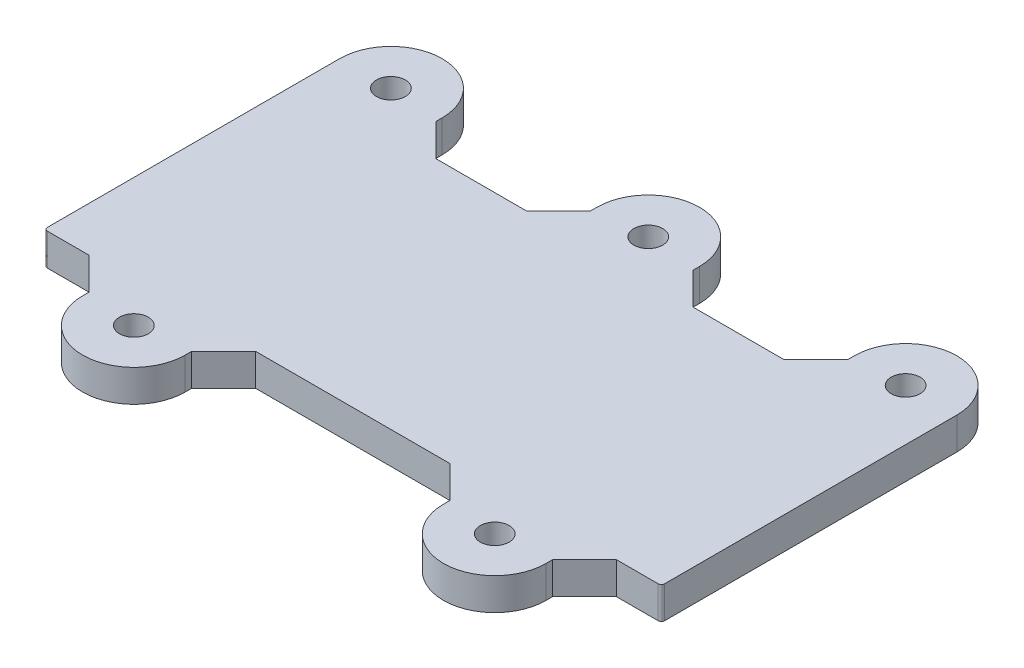
ISO-10303-21;
HEADER;
FILE_DESCRIPTION(('STEP AP214'),'2;1');
FILE_NAME('part.step','',(''),(''),'','','');
FILE_SCHEMA(('AUTOMOTIVE_DESIGN { 1 0 10303 214 1 1 1 1 }'));
ENDSEC;
DATA;
#1=APPLICATION_CONTEXT('core data for automotive mechanical design processes');
#2=APPLICATION_PROTOCOL_DEFINITION('international standard','automotive_design',2000,#1);
#3=PRODUCT_CONTEXT('',#1,'mechanical');
#4=PRODUCT('Part','Part','',(#3));
#5=PRODUCT_RELATED_PRODUCT_CATEGORY('part','',(#4));
#6=PRODUCT_DEFINITION_FORMATION('','',#4);
#7=PRODUCT_DEFINITION_CONTEXT('part definition',#1,'design');
#8=PRODUCT_DEFINITION('design','',#6,#7);
#9=PRODUCT_DEFINITION_SHAPE('','',#8);
#10=(LENGTH_UNIT() NAMED_UNIT(*) SI_UNIT(.MILLI.,.METRE.));
#11=(NAMED_UNIT(*) PLANE_ANGLE_UNIT() SI_UNIT($,.RADIAN.));
#12=(NAMED_UNIT(*) SI_UNIT($,.STERADIAN.) SOLID_ANGLE_UNIT());
#13=UNCERTAINTY_MEASURE_WITH_UNIT(LENGTH_MEASURE(1.E-05),#10,'distance_accuracy_value','');
#14=(GEOMETRIC_REPRESENTATION_CONTEXT(3) GLOBAL_UNCERTAINTY_ASSIGNED_CONTEXT((#13)) GLOBAL_UNIT_ASSIGNED_CONTEXT((#10,
#11,#12)) REPRESENTATION_CONTEXT('',''));
#15=CARTESIAN_POINT('',(0.,0.,0.));
#16=DIRECTION('',(0.,0.,1.));
#17=DIRECTION('',(1.,0.,0.));
#18=AXIS2_PLACEMENT_3D('',#15,#16,#17);
#19=CARTESIAN_POINT('',(48.15,5.,20.05));
#20=DIRECTION('',(0.,0.,-1.));
#21=DIRECTION('',(-1.,0.,0.));
#22=AXIS2_PLACEMENT_3D('',#19,#20,#21);
#23=PLANE('',#22);
#24=DIRECTION('',(1.,0.,0.));
#25=VECTOR('',#24,1.);
#26=CARTESIAN_POINT('',(48.15,0.,20.05));
#27=LINE('',#26,#25);
#28=CARTESIAN_POINT('',(41.15,0.,20.05));
#29=VERTEX_POINT('',#28);
#30=CARTESIAN_POINT('',(47.6500000000001,0.,20.05));
#31=VERTEX_POINT('',#30);
#32=EDGE_CURVE('E299',#29,#31,#27,.T.);
#33=ORIENTED_EDGE('',*,*,#32,.T.);
#34=DIRECTION('',(0.,-1.,0.));
#35=VECTOR('',#34,1.);
#36=CARTESIAN_POINT('',(47.6500000000001,5.,20.05));
#37=LINE('',#36,#35);
#38=CARTESIAN_POINT('',(47.6500000000001,5.,20.05));
#39=VERTEX_POINT('',#38);
#40=EDGE_CURVE('E12',#31,#39,#37,.F.);
#41=ORIENTED_EDGE('',*,*,#40,.T.);
#42=DIRECTION('',(1.,0.,0.));
#43=VECTOR('',#42,1.);
#44=CARTESIAN_POINT('',(48.15,5.,20.05));
#45=LINE('',#44,#43);
#46=CARTESIAN_POINT('',(41.15,5.,20.05));
#47=VERTEX_POINT('',#46);
#48=EDGE_CURVE('E240',#47,#39,#45,.T.);
#49=ORIENTED_EDGE('',*,*,#48,.F.);
#50=DIRECTION('',(0.,-1.,0.));
#51=VECTOR('',#50,1.);
#52=CARTESIAN_POINT('',(41.15,0.,20.05));
#53=LINE('',#52,#51);
#54=EDGE_CURVE('E364',#47,#29,#53,.T.);
#55=ORIENTED_EDGE('',*,*,#54,.T.);
#56=EDGE_LOOP('',(#33,#41,#49,#55));
#57=FACE_BOUND('',#56,.T.);
#58=ADVANCED_FACE('F35',(#57),#23,.F.);
#59=CARTESIAN_POINT('',(48.15,5.,-20.05));
#60=DIRECTION('',(-1.,0.,0.));
#61=DIRECTION('',(0.,0.,1.));
#62=AXIS2_PLACEMENT_3D('',#59,#60,#61);
#63=PLANE('',#62);
#64=DIRECTION('',(0.,0.,-1.));
#65=VECTOR('',#64,1.);
#66=CARTESIAN_POINT('',(48.15,5.,20.05));
#67=LINE('',#66,#65);
#68=CARTESIAN_POINT('',(48.15,5.,19.55));
#69=VERTEX_POINT('',#68);
#70=CARTESIAN_POINT('',(48.15,5.,-26.05));
#71=VERTEX_POINT('',#70);
#72=EDGE_CURVE('E229',#69,#71,#67,.T.);
#73=ORIENTED_EDGE('',*,*,#72,.F.);
#74=DIRECTION('',(0.,-1.,0.));
#75=VECTOR('',#74,1.);
#76=CARTESIAN_POINT('',(48.1500000000001,5.,19.55));
#77=LINE('',#76,#75);
#78=CARTESIAN_POINT('',(48.1500000000001,0.,19.55));
#79=VERTEX_POINT('',#78);
#80=EDGE_CURVE('E43',#69,#79,#77,.T.);
#81=ORIENTED_EDGE('',*,*,#80,.T.);
#82=DIRECTION('',(0.,0.,-1.));
#83=VECTOR('',#82,1.);
#84=CARTESIAN_POINT('',(48.15,0.,-20.05));
#85=LINE('',#84,#83);
#86=CARTESIAN_POINT('',(48.15,0.,-26.05));
#87=VERTEX_POINT('',#86);
#88=EDGE_CURVE('E246',#79,#87,#85,.T.);
#89=ORIENTED_EDGE('',*,*,#88,.T.);
#90=DIRECTION('',(0.,-1.,0.));
#91=VECTOR('',#90,1.);
#92=CARTESIAN_POINT('',(48.15,5.,-26.05));
#93=LINE('',#92,#91);
#94=EDGE_CURVE('E243',#71,#87,#93,.T.);
#95=ORIENTED_EDGE('',*,*,#94,.F.);
#96=EDGE_LOOP('',(#73,#81,#89,#95));
#97=FACE_BOUND('',#96,.T.);
#98=ADVANCED_FACE('F244',(#97),#63,.F.);
#99=CARTESIAN_POINT('',(40.15,5.,-26.05));
#100=DIRECTION('',(0.,-1.,0.));
#101=DIRECTION('',(0.,0.,-1.));
#102=AXIS2_PLACEMENT_3D('',#99,#100,#101);
#103=CYLINDRICAL_SURFACE('',#102,8.);
#104=CARTESIAN_POINT('',(40.15,0.,-26.05));
#105=DIRECTION('',(0.,1.,0.));
#106=DIRECTION('',(0.,0.,-1.));
#107=AXIS2_PLACEMENT_3D('',#104,#105,#106);
#108=CIRCLE('',#107,8.);
#109=CARTESIAN_POINT('',(32.15,0.,-26.05));
#110=VERTEX_POINT('',#109);
#111=EDGE_CURVE('E891',#87,#110,#108,.T.);
#112=ORIENTED_EDGE('',*,*,#111,.T.);
#113=DIRECTION('',(0.,-1.,0.));
#114=VECTOR('',#113,1.);
#115=CARTESIAN_POINT('',(32.15,5.,-26.05));
#116=LINE('',#115,#114);
#117=CARTESIAN_POINT('',(32.15,5.,-26.05));
#118=VERTEX_POINT('',#117);
#119=EDGE_CURVE('E250',#118,#110,#116,.T.);
#120=ORIENTED_EDGE('',*,*,#119,.F.);
#121=CARTESIAN_POINT('',(40.15,5.,-26.05));
#122=DIRECTION('',(0.,1.,0.));
#123=DIRECTION('',(0.,0.,-1.));
#124=AXIS2_PLACEMENT_3D('',#121,#122,#123);
#125=CIRCLE('',#124,8.);
#126=EDGE_CURVE('E235',#71,#118,#125,.T.);
#127=ORIENTED_EDGE('',*,*,#126,.F.);
#128=ORIENTED_EDGE('',*,*,#94,.T.);
#129=EDGE_LOOP('',(#112,#120,#127,#128));
#130=FACE_BOUND('',#129,.T.);
#131=ADVANCED_FACE('F252',(#130),#103,.T.);
#132=CARTESIAN_POINT('',(32.15,5.,-26.05));
#133=DIRECTION('',(1.,0.,0.));
#134=DIRECTION('',(0.,0.,-1.));
#135=AXIS2_PLACEMENT_3D('',#132,#133,#134);
#136=PLANE('',#135);
#137=DIRECTION('',(0.,0.,1.));
#138=VECTOR('',#137,1.);
#139=CARTESIAN_POINT('',(32.15,0.,-26.05));
#140=LINE('',#139,#138);
#141=CARTESIAN_POINT('',(32.15,0.,-25.05));
#142=VERTEX_POINT('',#141);
#143=EDGE_CURVE('E892',#110,#142,#140,.T.);
#144=ORIENTED_EDGE('',*,*,#143,.T.);
#145=DIRECTION('',(0.,1.,0.));
#146=VECTOR('',#145,1.);
#147=CARTESIAN_POINT('',(32.15,5.,-25.05));
#148=LINE('',#147,#146);
#149=CARTESIAN_POINT('',(32.15,5.,-25.05));
#150=VERTEX_POINT('',#149);
#151=EDGE_CURVE('E362',#142,#150,#148,.T.);
#152=ORIENTED_EDGE('',*,*,#151,.T.);
#153=DIRECTION('',(0.,0.,1.));
#154=VECTOR('',#153,1.);
#155=CARTESIAN_POINT('',(32.15,5.,-26.05));
#156=LINE('',#155,#154);
#157=EDGE_CURVE('E255',#118,#150,#156,.T.);
#158=ORIENTED_EDGE('',*,*,#157,.F.);
#159=ORIENTED_EDGE('',*,*,#119,.T.);
#160=EDGE_LOOP('',(#144,#152,#158,#159));
#161=FACE_BOUND('',#160,.T.);
#162=ADVANCED_FACE('F664',(#161),#136,.F.);
#163=CARTESIAN_POINT('',(32.15,5.,-20.05));
#164=DIRECTION('',(0.,0.,1.));
#165=DIRECTION('',(1.,0.,0.));
#166=AXIS2_PLACEMENT_3D('',#163,#164,#165);
#167=PLANE('',#166);
#168=DIRECTION('',(-1.,0.,0.));
#169=VECTOR('',#168,1.);
#170=CARTESIAN_POINT('',(32.15,0.,-20.05));
#171=LINE('',#170,#169);
#172=CARTESIAN_POINT('',(27.15,0.,-20.05));
#173=VERTEX_POINT('',#172);
#174=CARTESIAN_POINT('',(13.,0.,-20.05));
#175=VERTEX_POINT('',#174);
#176=EDGE_CURVE('E894',#173,#175,#171,.T.);
#177=ORIENTED_EDGE('',*,*,#176,.T.);
#178=DIRECTION('',(0.,1.,0.));
#179=VECTOR('',#178,1.);
#180=CARTESIAN_POINT('',(13.,5.,-20.05));
#181=LINE('',#180,#179);
#182=CARTESIAN_POINT('',(13.,5.,-20.05));
#183=VERTEX_POINT('',#182);
#184=EDGE_CURVE('E360',#175,#183,#181,.T.);
#185=ORIENTED_EDGE('',*,*,#184,.T.);
#186=DIRECTION('',(-1.,0.,0.));
#187=VECTOR('',#186,1.);
#188=CARTESIAN_POINT('',(32.15,5.,-20.05));
#189=LINE('',#188,#187);
#190=CARTESIAN_POINT('',(27.15,5.,-20.05));
#191=VERTEX_POINT('',#190);
#192=EDGE_CURVE('E257',#191,#183,#189,.T.);
#193=ORIENTED_EDGE('',*,*,#192,.F.);
#194=DIRECTION('',(0.,-1.,0.));
#195=VECTOR('',#194,1.);
#196=CARTESIAN_POINT('',(27.15,0.,-20.05));
#197=LINE('',#196,#195);
#198=EDGE_CURVE('E357',#191,#173,#197,.T.);
#199=ORIENTED_EDGE('',*,*,#198,.T.);
#200=EDGE_LOOP('',(#177,#185,#193,#199));
#201=FACE_BOUND('',#200,.T.);
#202=ADVANCED_FACE('F660',(#201),#167,.F.);
#203=CARTESIAN_POINT('',(7.99999999999999,5.,-26.05));
#204=DIRECTION('',(-1.,0.,0.));
#205=DIRECTION('',(0.,0.,1.));
#206=AXIS2_PLACEMENT_3D('',#203,#204,#205);
#207=PLANE('',#206);
#208=DIRECTION('',(0.,0.,-1.));
#209=VECTOR('',#208,1.);
#210=CARTESIAN_POINT('',(7.99999999999999,5.,-26.05));
#211=LINE('',#210,#209);
#212=CARTESIAN_POINT('',(7.99999999999999,5.,-25.05));
#213=VERTEX_POINT('',#212);
#214=CARTESIAN_POINT('',(7.99999999999999,5.,-26.05));
#215=VERTEX_POINT('',#214);
#216=EDGE_CURVE('E263',#213,#215,#211,.T.);
#217=ORIENTED_EDGE('',*,*,#216,.F.);
#218=DIRECTION('',(0.,-1.,0.));
#219=VECTOR('',#218,1.);
#220=CARTESIAN_POINT('',(7.99999999999999,0.,-25.05));
#221=LINE('',#220,#219);
#222=CARTESIAN_POINT('',(7.99999999999999,0.,-25.05));
#223=VERTEX_POINT('',#222);
#224=EDGE_CURVE('E354',#213,#223,#221,.T.);
#225=ORIENTED_EDGE('',*,*,#224,.T.);
#226=DIRECTION('',(0.,0.,-1.));
#227=VECTOR('',#226,1.);
#228=CARTESIAN_POINT('',(7.99999999999999,0.,-26.05));
#229=LINE('',#228,#227);
#230=CARTESIAN_POINT('',(7.99999999999999,0.,-26.05));
#231=VERTEX_POINT('',#230);
#232=EDGE_CURVE('E907',#223,#231,#229,.T.);
#233=ORIENTED_EDGE('',*,*,#232,.T.);
#234=DIRECTION('',(0.,-1.,0.));
#235=VECTOR('',#234,1.);
#236=CARTESIAN_POINT('',(7.99999999999999,5.,-26.05));
#237=LINE('',#236,#235);
#238=EDGE_CURVE('E341',#215,#231,#237,.T.);
#239=ORIENTED_EDGE('',*,*,#238,.F.);
#240=EDGE_LOOP('',(#217,#225,#233,#239));
#241=FACE_BOUND('',#240,.T.);
#242=ADVANCED_FACE('F656',(#241),#207,.F.);
#243=CARTESIAN_POINT('',(0.,5.,-26.05));
#244=DIRECTION('',(0.,-1.,0.));
#245=DIRECTION('',(0.,0.,-1.));
#246=AXIS2_PLACEMENT_3D('',#243,#244,#245);
#247=CYLINDRICAL_SURFACE('',#246,8.);
#248=CARTESIAN_POINT('',(0.,0.,-26.05));
#249=DIRECTION('',(0.,1.,0.));
#250=DIRECTION('',(0.,0.,1.));
#251=AXIS2_PLACEMENT_3D('',#248,#249,#250);
#252=CIRCLE('',#251,8.);
#253=CARTESIAN_POINT('',(-8.00000000000001,0.,-26.05));
#254=VERTEX_POINT('',#253);
#255=EDGE_CURVE('E910',#231,#254,#252,.T.);
#256=ORIENTED_EDGE('',*,*,#255,.T.);
#257=DIRECTION('',(0.,-1.,0.));
#258=VECTOR('',#257,1.);
#259=CARTESIAN_POINT('',(-8.00000000000001,5.,-26.05));
#260=LINE('',#259,#258);
#261=CARTESIAN_POINT('',(-8.00000000000001,5.,-26.05));
#262=VERTEX_POINT('',#261);
#263=EDGE_CURVE('E338',#262,#254,#260,.T.);
#264=ORIENTED_EDGE('',*,*,#263,.F.);
#265=CARTESIAN_POINT('',(0.,5.,-26.05));
#266=DIRECTION('',(0.,1.,0.));
#267=DIRECTION('',(0.,0.,1.));
#268=AXIS2_PLACEMENT_3D('',#265,#266,#267);
#269=CIRCLE('',#268,8.);
#270=EDGE_CURVE('E265',#215,#262,#269,.T.);
#271=ORIENTED_EDGE('',*,*,#270,.F.);
#272=ORIENTED_EDGE('',*,*,#238,.T.);
#273=EDGE_LOOP('',(#256,#264,#271,#272));
#274=FACE_BOUND('',#273,.T.);
#275=ADVANCED_FACE('F652',(#274),#247,.T.);
#276=CARTESIAN_POINT('',(-8.00000000000001,5.,-26.05));
#277=DIRECTION('',(1.,0.,0.));
#278=DIRECTION('',(0.,0.,-1.));
#279=AXIS2_PLACEMENT_3D('',#276,#277,#278);
#280=PLANE('',#279);
#281=DIRECTION('',(0.,0.,1.));
#282=VECTOR('',#281,1.);
#283=CARTESIAN_POINT('',(-8.00000000000001,0.,-26.05));
#284=LINE('',#283,#282);
#285=CARTESIAN_POINT('',(-8.00000000000001,0.,-25.05));
#286=VERTEX_POINT('',#285);
#287=EDGE_CURVE('E913',#254,#286,#284,.T.);
#288=ORIENTED_EDGE('',*,*,#287,.T.);
#289=DIRECTION('',(0.,1.,0.));
#290=VECTOR('',#289,1.);
#291=CARTESIAN_POINT('',(-8.00000000000001,5.,-25.05));
#292=LINE('',#291,#290);
#293=CARTESIAN_POINT('',(-8.00000000000001,5.,-25.05));
#294=VERTEX_POINT('',#293);
#295=EDGE_CURVE('E352',#286,#294,#292,.T.);
#296=ORIENTED_EDGE('',*,*,#295,.T.);
#297=DIRECTION('',(0.,0.,1.));
#298=VECTOR('',#297,1.);
#299=CARTESIAN_POINT('',(-8.00000000000001,5.,-26.05));
#300=LINE('',#299,#298);
#301=EDGE_CURVE('E267',#262,#294,#300,.T.);
#302=ORIENTED_EDGE('',*,*,#301,.F.);
#303=ORIENTED_EDGE('',*,*,#263,.T.);
#304=EDGE_LOOP('',(#288,#296,#302,#303));
#305=FACE_BOUND('',#304,.T.);
#306=ADVANCED_FACE('F648',(#305),#280,.F.);
#307=CARTESIAN_POINT('',(-8.00000000000001,5.,-20.05));
#308=DIRECTION('',(0.,0.,1.));
#309=DIRECTION('',(1.,0.,0.));
#310=AXIS2_PLACEMENT_3D('',#307,#308,#309);
#311=PLANE('',#310);
#312=DIRECTION('',(-1.,0.,0.));
#313=VECTOR('',#312,1.);
#314=CARTESIAN_POINT('',(-8.00000000000001,0.,-20.05));
#315=LINE('',#314,#313);
#316=CARTESIAN_POINT('',(-13.,0.,-20.05));
#317=VERTEX_POINT('',#316);
#318=CARTESIAN_POINT('',(-27.15,0.,-20.05));
#319=VERTEX_POINT('',#318);
#320=EDGE_CURVE('E918',#317,#319,#315,.T.);
#321=ORIENTED_EDGE('',*,*,#320,.T.);
#322=DIRECTION('',(0.,1.,0.));
#323=VECTOR('',#322,1.);
#324=CARTESIAN_POINT('',(-27.15,5.,-20.05));
#325=LINE('',#324,#323);
#326=CARTESIAN_POINT('',(-27.15,5.,-20.05));
#327=VERTEX_POINT('',#326);
#328=EDGE_CURVE('E350',#319,#327,#325,.T.);
#329=ORIENTED_EDGE('',*,*,#328,.T.);
#330=DIRECTION('',(-1.,0.,0.));
#331=VECTOR('',#330,1.);
#332=CARTESIAN_POINT('',(-8.00000000000001,5.,-20.05));
#333=LINE('',#332,#331);
#334=CARTESIAN_POINT('',(-13.,5.,-20.05));
#335=VERTEX_POINT('',#334);
#336=EDGE_CURVE('E270',#335,#327,#333,.T.);
#337=ORIENTED_EDGE('',*,*,#336,.F.);
#338=DIRECTION('',(0.,-1.,0.));
#339=VECTOR('',#338,1.);
#340=CARTESIAN_POINT('',(-13.,0.,-20.05));
#341=LINE('',#340,#339);
#342=EDGE_CURVE('E347',#335,#317,#341,.T.);
#343=ORIENTED_EDGE('',*,*,#342,.T.);
#344=EDGE_LOOP('',(#321,#329,#337,#343));
#345=FACE_BOUND('',#344,.T.);
#346=ADVANCED_FACE('F644',(#345),#311,.F.);
#347=CARTESIAN_POINT('',(-32.15,5.,-26.05));
#348=DIRECTION('',(-1.,0.,0.));
#349=DIRECTION('',(0.,0.,1.));
#350=AXIS2_PLACEMENT_3D('',#347,#348,#349);
#351=PLANE('',#350);
#352=DIRECTION('',(0.,0.,-1.));
#353=VECTOR('',#352,1.);
#354=CARTESIAN_POINT('',(-32.15,5.,-26.05));
#355=LINE('',#354,#353);
#356=CARTESIAN_POINT('',(-32.15,5.,-25.05));
#357=VERTEX_POINT('',#356);
#358=CARTESIAN_POINT('',(-32.15,5.,-26.05));
#359=VERTEX_POINT('',#358);
#360=EDGE_CURVE('E273',#357,#359,#355,.T.);
#361=ORIENTED_EDGE('',*,*,#360,.F.);
#362=DIRECTION('',(0.,-1.,0.));
#363=VECTOR('',#362,1.);
#364=CARTESIAN_POINT('',(-32.15,0.,-25.05));
#365=LINE('',#364,#363);
#366=CARTESIAN_POINT('',(-32.15,0.,-25.05));
#367=VERTEX_POINT('',#366);
#368=EDGE_CURVE('E249',#357,#367,#365,.T.);
#369=ORIENTED_EDGE('',*,*,#368,.T.);
#370=DIRECTION('',(0.,0.,-1.));
#371=VECTOR('',#370,1.);
#372=CARTESIAN_POINT('',(-32.15,0.,-26.05));
#373=LINE('',#372,#371);
#374=CARTESIAN_POINT('',(-32.15,0.,-26.05));
#375=VERTEX_POINT('',#374);
#376=EDGE_CURVE('E921',#367,#375,#373,.T.);
#377=ORIENTED_EDGE('',*,*,#376,.T.);
#378=DIRECTION('',(0.,-1.,0.));
#379=VECTOR('',#378,1.);
#380=CARTESIAN_POINT('',(-32.15,5.,-26.05));
#381=LINE('',#380,#379);
#382=EDGE_CURVE('E335',#359,#375,#381,.T.);
#383=ORIENTED_EDGE('',*,*,#382,.F.);
#384=EDGE_LOOP('',(#361,#369,#377,#383));
#385=FACE_BOUND('',#384,.T.);
#386=ADVANCED_FACE('F640',(#385),#351,.F.);
#387=CARTESIAN_POINT('',(-40.15,5.,-26.05));
#388=DIRECTION('',(0.,-1.,0.));
#389=DIRECTION('',(0.,0.,-1.));
#390=AXIS2_PLACEMENT_3D('',#387,#388,#389);
#391=CYLINDRICAL_SURFACE('',#390,8.);
#392=CARTESIAN_POINT('',(-40.15,0.,-26.05));
#393=DIRECTION('',(0.,1.,0.));
#394=DIRECTION('',(0.,0.,1.));
#395=AXIS2_PLACEMENT_3D('',#392,#393,#394);
#396=CIRCLE('',#395,8.);
#397=CARTESIAN_POINT('',(-48.15,0.,-26.05));
#398=VERTEX_POINT('',#397);
#399=EDGE_CURVE('E441',#375,#398,#396,.T.);
#400=ORIENTED_EDGE('',*,*,#399,.T.);
#401=DIRECTION('',(0.,-1.,0.));
#402=VECTOR('',#401,1.);
#403=CARTESIAN_POINT('',(-48.15,5.,-26.05));
#404=LINE('',#403,#402);
#405=CARTESIAN_POINT('',(-48.15,5.,-26.05));
#406=VERTEX_POINT('',#405);
#407=EDGE_CURVE('E332',#406,#398,#404,.T.);
#408=ORIENTED_EDGE('',*,*,#407,.F.);
#409=CARTESIAN_POINT('',(-40.15,5.,-26.05));
#410=DIRECTION('',(0.,1.,0.));
#411=DIRECTION('',(0.,0.,1.));
#412=AXIS2_PLACEMENT_3D('',#409,#410,#411);
#413=CIRCLE('',#412,8.);
#414=EDGE_CURVE('E275',#359,#406,#413,.T.);
#415=ORIENTED_EDGE('',*,*,#414,.F.);
#416=ORIENTED_EDGE('',*,*,#382,.T.);
#417=EDGE_LOOP('',(#400,#408,#415,#416));
#418=FACE_BOUND('',#417,.T.);
#419=ADVANCED_FACE('F636',(#418),#391,.T.);
#420=CARTESIAN_POINT('',(-48.15,5.,20.05));
#421=DIRECTION('',(1.,0.,0.));
#422=DIRECTION('',(0.,0.,-1.));
#423=AXIS2_PLACEMENT_3D('',#420,#421,#422);
#424=PLANE('',#423);
#425=DIRECTION('',(0.,0.,1.));
#426=VECTOR('',#425,1.);
#427=CARTESIAN_POINT('',(-48.15,0.,20.05));
#428=LINE('',#427,#426);
#429=CARTESIAN_POINT('',(-48.15,0.,19.55));
#430=VERTEX_POINT('',#429);
#431=EDGE_CURVE('E437',#398,#430,#428,.T.);
#432=ORIENTED_EDGE('',*,*,#431,.T.);
#433=DIRECTION('',(0.,-1.,0.));
#434=VECTOR('',#433,1.);
#435=CARTESIAN_POINT('',(-48.15,5.,19.55));
#436=LINE('',#435,#434);
#437=CARTESIAN_POINT('',(-48.15,5.,19.55));
#438=VERTEX_POINT('',#437);
#439=EDGE_CURVE('E426',#430,#438,#436,.F.);
#440=ORIENTED_EDGE('',*,*,#439,.T.);
#441=DIRECTION('',(0.,0.,1.));
#442=VECTOR('',#441,1.);
#443=CARTESIAN_POINT('',(-48.15,5.,-20.05));
#444=LINE('',#443,#442);
#445=EDGE_CURVE('E277',#406,#438,#444,.T.);
#446=ORIENTED_EDGE('',*,*,#445,.F.);
#447=ORIENTED_EDGE('',*,*,#407,.T.);
#448=EDGE_LOOP('',(#432,#440,#446,#447));
#449=FACE_BOUND('',#448,.T.);
#450=ADVANCED_FACE('F632',(#449),#424,.F.);
#451=CARTESIAN_POINT('',(-36.15,5.,20.05));
#452=DIRECTION('',(0.,0.,-1.));
#453=DIRECTION('',(-1.,0.,0.));
#454=AXIS2_PLACEMENT_3D('',#451,#452,#453);
#455=PLANE('',#454);
#456=DIRECTION('',(1.,0.,0.));
#457=VECTOR('',#456,1.);
#458=CARTESIAN_POINT('',(-36.15,5.,20.05));
#459=LINE('',#458,#457);
#460=CARTESIAN_POINT('',(-47.65,5.,20.05));
#461=VERTEX_POINT('',#460);
#462=CARTESIAN_POINT('',(-41.15,5.,20.05));
#463=VERTEX_POINT('',#462);
#464=EDGE_CURVE('E279',#461,#463,#459,.T.);
#465=ORIENTED_EDGE('',*,*,#464,.F.);
#466=DIRECTION('',(0.,-1.,0.));
#467=VECTOR('',#466,1.);
#468=CARTESIAN_POINT('',(-47.65,5.,20.05));
#469=LINE('',#468,#467);
#470=CARTESIAN_POINT('',(-47.65,0.,20.05));
#471=VERTEX_POINT('',#470);
#472=EDGE_CURVE('E418',#461,#471,#469,.T.);
#473=ORIENTED_EDGE('',*,*,#472,.T.);
#474=DIRECTION('',(1.,0.,0.));
#475=VECTOR('',#474,1.);
#476=CARTESIAN_POINT('',(-36.15,0.,20.05));
#477=LINE('',#476,#475);
#478=CARTESIAN_POINT('',(-41.15,0.,20.05));
#479=VERTEX_POINT('',#478);
#480=EDGE_CURVE('E440',#471,#479,#477,.T.);
#481=ORIENTED_EDGE('',*,*,#480,.T.);
#482=DIRECTION('',(0.,1.,0.));
#483=VECTOR('',#482,1.);
#484=CARTESIAN_POINT('',(-41.15,5.,20.05));
#485=LINE('',#484,#483);
#486=EDGE_CURVE('E382',#479,#463,#485,.T.);
#487=ORIENTED_EDGE('',*,*,#486,.T.);
#488=EDGE_LOOP('',(#465,#473,#481,#487));
#489=FACE_BOUND('',#488,.T.);
#490=ADVANCED_FACE('F629',(#489),#455,.F.);
#491=CARTESIAN_POINT('',(-36.15,5.,26.05));
#492=DIRECTION('',(1.,0.,0.));
#493=DIRECTION('',(0.,0.,-1.));
#494=AXIS2_PLACEMENT_3D('',#491,#492,#493);
#495=PLANE('',#494);
#496=DIRECTION('',(0.,0.,1.));
#497=VECTOR('',#496,1.);
#498=CARTESIAN_POINT('',(-36.15,5.,26.05));
#499=LINE('',#498,#497);
#500=CARTESIAN_POINT('',(-36.15,5.,25.05));
#501=VERTEX_POINT('',#500);
#502=CARTESIAN_POINT('',(-36.15,5.,26.05));
#503=VERTEX_POINT('',#502);
#504=EDGE_CURVE('E281',#501,#503,#499,.T.);
#505=ORIENTED_EDGE('',*,*,#504,.F.);
#506=DIRECTION('',(0.,-1.,0.));
#507=VECTOR('',#506,1.);
#508=CARTESIAN_POINT('',(-36.15,0.,25.05));
#509=LINE('',#508,#507);
#510=CARTESIAN_POINT('',(-36.15,0.,25.05));
#511=VERTEX_POINT('',#510);
#512=EDGE_CURVE('E379',#501,#511,#509,.T.);
#513=ORIENTED_EDGE('',*,*,#512,.T.);
#514=DIRECTION('',(0.,0.,1.));
#515=VECTOR('',#514,1.);
#516=CARTESIAN_POINT('',(-36.15,0.,26.05));
#517=LINE('',#516,#515);
#518=CARTESIAN_POINT('',(-36.15,0.,26.05));
#519=VERTEX_POINT('',#518);
#520=EDGE_CURVE('E445',#511,#519,#517,.T.);
#521=ORIENTED_EDGE('',*,*,#520,.T.);
#522=DIRECTION('',(0.,-1.,0.));
#523=VECTOR('',#522,1.);
#524=CARTESIAN_POINT('',(-36.15,5.,26.05));
#525=LINE('',#524,#523);
#526=EDGE_CURVE('E329',#503,#519,#525,.T.);
#527=ORIENTED_EDGE('',*,*,#526,.F.);
#528=EDGE_LOOP('',(#505,#513,#521,#527));
#529=FACE_BOUND('',#528,.T.);
#530=ADVANCED_FACE('F589',(#529),#495,.F.);
#531=CARTESIAN_POINT('',(-28.15,5.,26.05));
#532=DIRECTION('',(0.,-1.,0.));
#533=DIRECTION('',(0.,0.,-1.));
#534=AXIS2_PLACEMENT_3D('',#531,#532,#533);
#535=CYLINDRICAL_SURFACE('',#534,8.);
#536=CARTESIAN_POINT('',(-28.15,0.,26.05));
#537=DIRECTION('',(0.,1.,0.));
#538=DIRECTION('',(0.,0.,1.));
#539=AXIS2_PLACEMENT_3D('',#536,#537,#538);
#540=CIRCLE('',#539,8.);
#541=CARTESIAN_POINT('',(-20.15,0.,26.05));
#542=VERTEX_POINT('',#541);
#543=EDGE_CURVE('E448',#519,#542,#540,.T.);
#544=ORIENTED_EDGE('',*,*,#543,.T.);
#545=DIRECTION('',(0.,-1.,0.));
#546=VECTOR('',#545,1.);
#547=CARTESIAN_POINT('',(-20.15,5.,26.05));
#548=LINE('',#547,#546);
#549=CARTESIAN_POINT('',(-20.15,5.,26.05));
#550=VERTEX_POINT('',#549);
#551=EDGE_CURVE('E326',#550,#542,#548,.T.);
#552=ORIENTED_EDGE('',*,*,#551,.F.);
#553=CARTESIAN_POINT('',(-28.15,5.,26.05));
#554=DIRECTION('',(0.,1.,0.));
#555=DIRECTION('',(0.,0.,1.));
#556=AXIS2_PLACEMENT_3D('',#553,#554,#555);
#557=CIRCLE('',#556,8.);
#558=EDGE_CURVE('E283',#503,#550,#557,.T.);
#559=ORIENTED_EDGE('',*,*,#558,.F.);
#560=ORIENTED_EDGE('',*,*,#526,.T.);
#561=EDGE_LOOP('',(#544,#552,#559,#560));
#562=FACE_BOUND('',#561,.T.);
#563=ADVANCED_FACE('F595',(#562),#535,.T.);
#564=CARTESIAN_POINT('',(-20.15,5.,26.05));
#565=DIRECTION('',(-1.,0.,0.));
#566=DIRECTION('',(0.,0.,1.));
#567=AXIS2_PLACEMENT_3D('',#564,#565,#566);
#568=PLANE('',#567);
#569=DIRECTION('',(0.,0.,-1.));
#570=VECTOR('',#569,1.);
#571=CARTESIAN_POINT('',(-20.15,0.,26.05));
#572=LINE('',#571,#570);
#573=CARTESIAN_POINT('',(-20.15,0.,25.05));
#574=VERTEX_POINT('',#573);
#575=EDGE_CURVE('E451',#542,#574,#572,.T.);
#576=ORIENTED_EDGE('',*,*,#575,.T.);
#577=DIRECTION('',(0.,1.,0.));
#578=VECTOR('',#577,1.);
#579=CARTESIAN_POINT('',(-20.15,5.,25.05));
#580=LINE('',#579,#578);
#581=CARTESIAN_POINT('',(-20.15,5.,25.05));
#582=VERTEX_POINT('',#581);
#583=EDGE_CURVE('E377',#574,#582,#580,.T.);
#584=ORIENTED_EDGE('',*,*,#583,.T.);
#585=DIRECTION('',(0.,0.,-1.));
#586=VECTOR('',#585,1.);
#587=CARTESIAN_POINT('',(-20.15,5.,26.05));
#588=LINE('',#587,#586);
#589=EDGE_CURVE('E285',#550,#582,#588,.T.);
#590=ORIENTED_EDGE('',*,*,#589,.F.);
#591=ORIENTED_EDGE('',*,*,#551,.T.);
#592=EDGE_LOOP('',(#576,#584,#590,#591));
#593=FACE_BOUND('',#592,.T.);
#594=ADVANCED_FACE('F619',(#593),#568,.F.);
#595=CARTESIAN_POINT('',(20.15,5.,20.05));
#596=DIRECTION('',(0.,0.,-1.));
#597=DIRECTION('',(-1.,0.,0.));
#598=AXIS2_PLACEMENT_3D('',#595,#596,#597);
#599=PLANE('',#598);
#600=DIRECTION('',(1.,0.,0.));
#601=VECTOR('',#600,1.);
#602=CARTESIAN_POINT('',(20.15,0.,20.05));
#603=LINE('',#602,#601);
#604=CARTESIAN_POINT('',(-15.15,0.,20.05));
#605=VERTEX_POINT('',#604);
#606=CARTESIAN_POINT('',(15.15,0.,20.05));
#607=VERTEX_POINT('',#606);
#608=EDGE_CURVE('E456',#605,#607,#603,.T.);
#609=ORIENTED_EDGE('',*,*,#608,.T.);
#610=DIRECTION('',(0.,1.,0.));
#611=VECTOR('',#610,1.);
#612=CARTESIAN_POINT('',(15.15,5.,20.05));
#613=LINE('',#612,#611);
#614=CARTESIAN_POINT('',(15.15,5.,20.05));
#615=VERTEX_POINT('',#614);
#616=EDGE_CURVE('E375',#607,#615,#613,.T.);
#617=ORIENTED_EDGE('',*,*,#616,.T.);
#618=DIRECTION('',(1.,0.,0.));
#619=VECTOR('',#618,1.);
#620=CARTESIAN_POINT('',(20.15,5.,20.05));
#621=LINE('',#620,#619);
#622=CARTESIAN_POINT('',(-15.15,5.,20.05));
#623=VERTEX_POINT('',#622);
#624=EDGE_CURVE('E288',#623,#615,#621,.T.);
#625=ORIENTED_EDGE('',*,*,#624,.F.);
#626=DIRECTION('',(0.,-1.,0.));
#627=VECTOR('',#626,1.);
#628=CARTESIAN_POINT('',(-15.15,0.,20.05));
#629=LINE('',#628,#627);
#630=EDGE_CURVE('E372',#623,#605,#629,.T.);
#631=ORIENTED_EDGE('',*,*,#630,.T.);
#632=EDGE_LOOP('',(#609,#617,#625,#631));
#633=FACE_BOUND('',#632,.T.);
#634=ADVANCED_FACE('F604',(#633),#599,.F.);
#635=CARTESIAN_POINT('',(20.15,5.,26.05));
#636=DIRECTION('',(1.,0.,0.));
#637=DIRECTION('',(0.,0.,-1.));
#638=AXIS2_PLACEMENT_3D('',#635,#636,#637);
#639=PLANE('',#638);
#640=DIRECTION('',(0.,0.,1.));
#641=VECTOR('',#640,1.);
#642=CARTESIAN_POINT('',(20.15,5.,26.05));
#643=LINE('',#642,#641);
#644=CARTESIAN_POINT('',(20.15,5.,25.05));
#645=VERTEX_POINT('',#644);
#646=CARTESIAN_POINT('',(20.15,5.,26.05));
#647=VERTEX_POINT('',#646);
#648=EDGE_CURVE('E291',#645,#647,#643,.T.);
#649=ORIENTED_EDGE('',*,*,#648,.F.);
#650=DIRECTION('',(0.,-1.,0.));
#651=VECTOR('',#650,1.);
#652=CARTESIAN_POINT('',(20.15,0.,25.05));
#653=LINE('',#652,#651);
#654=CARTESIAN_POINT('',(20.15,0.,25.05));
#655=VERTEX_POINT('',#654);
#656=EDGE_CURVE('E369',#645,#655,#653,.T.);
#657=ORIENTED_EDGE('',*,*,#656,.T.);
#658=DIRECTION('',(0.,0.,1.));
#659=VECTOR('',#658,1.);
#660=CARTESIAN_POINT('',(20.15,0.,26.05));
#661=LINE('',#660,#659);
#662=CARTESIAN_POINT('',(20.15,0.,26.05));
#663=VERTEX_POINT('',#662);
#664=EDGE_CURVE('E459',#655,#663,#661,.T.);
#665=ORIENTED_EDGE('',*,*,#664,.T.);
#666=DIRECTION('',(0.,-1.,0.));
#667=VECTOR('',#666,1.);
#668=CARTESIAN_POINT('',(20.15,5.,26.05));
#669=LINE('',#668,#667);
#670=EDGE_CURVE('E323',#647,#663,#669,.T.);
#671=ORIENTED_EDGE('',*,*,#670,.F.);
#672=EDGE_LOOP('',(#649,#657,#665,#671));
#673=FACE_BOUND('',#672,.T.);
#674=ADVANCED_FACE('F611',(#673),#639,.F.);
#675=CARTESIAN_POINT('',(28.15,5.,26.05));
#676=DIRECTION('',(0.,-1.,0.));
#677=DIRECTION('',(0.,0.,-1.));
#678=AXIS2_PLACEMENT_3D('',#675,#676,#677);
#679=CYLINDRICAL_SURFACE('',#678,8.);
#680=CARTESIAN_POINT('',(28.15,0.,26.05));
#681=DIRECTION('',(0.,1.,0.));
#682=DIRECTION('',(0.,0.,-1.));
#683=AXIS2_PLACEMENT_3D('',#680,#681,#682);
#684=CIRCLE('',#683,8.);
#685=CARTESIAN_POINT('',(36.15,0.,26.05));
#686=VERTEX_POINT('',#685);
#687=EDGE_CURVE('E318',#663,#686,#684,.T.);
#688=ORIENTED_EDGE('',*,*,#687,.T.);
#689=DIRECTION('',(0.,-1.,0.));
#690=VECTOR('',#689,1.);
#691=CARTESIAN_POINT('',(36.15,5.,26.05));
#692=LINE('',#691,#690);
#693=CARTESIAN_POINT('',(36.15,5.,26.05));
#694=VERTEX_POINT('',#693);
#695=EDGE_CURVE('E298',#694,#686,#692,.T.);
#696=ORIENTED_EDGE('',*,*,#695,.F.);
#697=CARTESIAN_POINT('',(28.15,5.,26.05));
#698=DIRECTION('',(0.,1.,0.));
#699=DIRECTION('',(0.,0.,-1.));
#700=AXIS2_PLACEMENT_3D('',#697,#698,#699);
#701=CIRCLE('',#700,8.);
#702=EDGE_CURVE('E293',#647,#694,#701,.T.);
#703=ORIENTED_EDGE('',*,*,#702,.F.);
#704=ORIENTED_EDGE('',*,*,#670,.T.);
#705=EDGE_LOOP('',(#688,#696,#703,#704));
#706=FACE_BOUND('',#705,.T.);
#707=ADVANCED_FACE('F467',(#706),#679,.T.);
#708=CARTESIAN_POINT('',(36.15,5.,26.05));
#709=DIRECTION('',(-1.,0.,0.));
#710=DIRECTION('',(0.,0.,1.));
#711=AXIS2_PLACEMENT_3D('',#708,#709,#710);
#712=PLANE('',#711);
#713=DIRECTION('',(0.,0.,-1.));
#714=VECTOR('',#713,1.);
#715=CARTESIAN_POINT('',(36.15,0.,26.05));
#716=LINE('',#715,#714);
#717=CARTESIAN_POINT('',(36.15,0.,25.05));
#718=VERTEX_POINT('',#717);
#719=EDGE_CURVE('E314',#686,#718,#716,.T.);
#720=ORIENTED_EDGE('',*,*,#719,.T.);
#721=DIRECTION('',(0.,1.,0.));
#722=VECTOR('',#721,1.);
#723=CARTESIAN_POINT('',(36.15,5.,25.05));
#724=LINE('',#723,#722);
#725=CARTESIAN_POINT('',(36.15,5.,25.05));
#726=VERTEX_POINT('',#725);
#727=EDGE_CURVE('E367',#718,#726,#724,.T.);
#728=ORIENTED_EDGE('',*,*,#727,.T.);
#729=DIRECTION('',(0.,0.,-1.));
#730=VECTOR('',#729,1.);
#731=CARTESIAN_POINT('',(36.15,5.,26.05));
#732=LINE('',#731,#730);
#733=EDGE_CURVE('E295',#694,#726,#732,.T.);
#734=ORIENTED_EDGE('',*,*,#733,.F.);
#735=ORIENTED_EDGE('',*,*,#695,.T.);
#736=EDGE_LOOP('',(#720,#728,#734,#735));
#737=FACE_BOUND('',#736,.T.);
#738=ADVANCED_FACE('F473',(#737),#712,.F.);
#739=CARTESIAN_POINT('',(28.15,5.,26.05));
#740=DIRECTION('',(0.,-1.,0.));
#741=DIRECTION('',(0.,0.,-1.));
#742=AXIS2_PLACEMENT_3D('',#739,#740,#741);
#743=PLANE('',#742);
#744=CARTESIAN_POINT('',(40.15,5.,-26.05));
#745=DIRECTION('',(0.,-1.,0.));
#746=DIRECTION('',(0.,0.,-1.));
#747=AXIS2_PLACEMENT_3D('',#744,#745,#746);
#748=CIRCLE('',#747,2.25);
#749=CARTESIAN_POINT('',(40.15,5.,-28.3));
#750=VERTEX_POINT('',#749);
#751=EDGE_CURVE('E512',#750,#750,#748,.T.);
#752=ORIENTED_EDGE('',*,*,#751,.T.);
#753=EDGE_LOOP('',(#752));
#754=FACE_BOUND('',#753,.T.);
#755=CARTESIAN_POINT('',(0.,5.,-26.05));
#756=DIRECTION('',(0.,-1.,0.));
#757=DIRECTION('',(0.,0.,-1.));
#758=AXIS2_PLACEMENT_3D('',#755,#756,#757);
#759=CIRCLE('',#758,2.25);
#760=CARTESIAN_POINT('',(0.,5.,-28.3));
#761=VERTEX_POINT('',#760);
#762=EDGE_CURVE('E505',#761,#761,#759,.T.);
#763=ORIENTED_EDGE('',*,*,#762,.T.);
#764=EDGE_LOOP('',(#763));
#765=FACE_BOUND('',#764,.T.);
#766=CARTESIAN_POINT('',(-40.15,5.,-26.05));
#767=DIRECTION('',(0.,-1.,0.));
#768=DIRECTION('',(0.,0.,-1.));
#769=AXIS2_PLACEMENT_3D('',#766,#767,#768);
#770=CIRCLE('',#769,2.25);
#771=CARTESIAN_POINT('',(-40.15,5.,-28.3));
#772=VERTEX_POINT('',#771);
#773=EDGE_CURVE('E499',#772,#772,#770,.T.);
#774=ORIENTED_EDGE('',*,*,#773,.T.);
#775=EDGE_LOOP('',(#774));
#776=FACE_BOUND('',#775,.T.);
#777=CARTESIAN_POINT('',(-28.15,5.,26.05));
#778=DIRECTION('',(0.,-1.,0.));
#779=DIRECTION('',(0.,0.,-1.));
#780=AXIS2_PLACEMENT_3D('',#777,#778,#779);
#781=CIRCLE('',#780,2.25);
#782=CARTESIAN_POINT('',(-28.15,5.,23.8));
#783=VERTEX_POINT('',#782);
#784=EDGE_CURVE('E489',#783,#783,#781,.T.);
#785=ORIENTED_EDGE('',*,*,#784,.T.);
#786=EDGE_LOOP('',(#785));
#787=FACE_BOUND('',#786,.T.);
#788=CARTESIAN_POINT('',(28.15,5.,26.05));
#789=DIRECTION('',(0.,-1.,0.));
#790=DIRECTION('',(0.,0.,-1.));
#791=AXIS2_PLACEMENT_3D('',#788,#789,#790);
#792=CIRCLE('',#791,2.25);
#793=CARTESIAN_POINT('',(28.15,5.,23.8));
#794=VERTEX_POINT('',#793);
#795=EDGE_CURVE('E302',#794,#794,#792,.T.);
#796=ORIENTED_EDGE('',*,*,#795,.T.);
#797=EDGE_LOOP('',(#796));
#798=FACE_BOUND('',#797,.T.);
#799=ORIENTED_EDGE('',*,*,#445,.T.);
#800=CARTESIAN_POINT('',(-47.65,5.,19.55));
#801=DIRECTION('',(0.,-1.,0.));
#802=DIRECTION('',(0.,0.,-1.));
#803=AXIS2_PLACEMENT_3D('',#800,#801,#802);
#804=CIRCLE('',#803,0.5);
#805=EDGE_CURVE('E888',#438,#461,#804,.F.);
#806=ORIENTED_EDGE('',*,*,#805,.T.);
#807=ORIENTED_EDGE('',*,*,#464,.T.);
#808=DIRECTION('',(-0.707106781186545,0.,-0.70710678118655));
#809=VECTOR('',#808,1.);
#810=CARTESIAN_POINT('',(-3.50000000000028,5.,57.7));
#811=LINE('',#810,#809);
#812=EDGE_CURVE('E416',#463,#501,#811,.F.);
#813=ORIENTED_EDGE('',*,*,#812,.T.);
#814=ORIENTED_EDGE('',*,*,#504,.T.);
#815=ORIENTED_EDGE('',*,*,#558,.T.);
#816=ORIENTED_EDGE('',*,*,#589,.T.);
#817=DIRECTION('',(-0.70710678118655,0.,0.707106781186545));
#818=VECTOR('',#817,1.);
#819=CARTESIAN_POINT('',(3.50000000000019,5.,1.4));
#820=LINE('',#819,#818);
#821=EDGE_CURVE('E411',#582,#623,#820,.F.);
#822=ORIENTED_EDGE('',*,*,#821,.T.);
#823=ORIENTED_EDGE('',*,*,#624,.T.);
#824=DIRECTION('',(-0.707106781186545,0.,-0.70710678118655));
#825=VECTOR('',#824,1.);
#826=CARTESIAN_POINT('',(24.6499999999999,5.,29.55));
#827=LINE('',#826,#825);
#828=EDGE_CURVE('E407',#615,#645,#827,.F.);
#829=ORIENTED_EDGE('',*,*,#828,.T.);
#830=ORIENTED_EDGE('',*,*,#648,.T.);
#831=ORIENTED_EDGE('',*,*,#702,.T.);
#832=ORIENTED_EDGE('',*,*,#733,.T.);
#833=DIRECTION('',(-0.707106781186551,0.,0.707106781186544));
#834=VECTOR('',#833,1.);
#835=CARTESIAN_POINT('',(31.6499999999999,5.,29.55));
#836=LINE('',#835,#834);
#837=EDGE_CURVE('E403',#726,#47,#836,.F.);
#838=ORIENTED_EDGE('',*,*,#837,.T.);
#839=ORIENTED_EDGE('',*,*,#48,.T.);
#840=CARTESIAN_POINT('',(47.6500000000001,5.,19.55));
#841=DIRECTION('',(0.,-1.,0.));
#842=DIRECTION('',(0.,0.,-1.));
#843=AXIS2_PLACEMENT_3D('',#840,#841,#842);
#844=CIRCLE('',#843,0.5);
#845=EDGE_CURVE('E50',#39,#69,#844,.F.);
#846=ORIENTED_EDGE('',*,*,#845,.T.);
#847=ORIENTED_EDGE('',*,*,#72,.T.);
#848=ORIENTED_EDGE('',*,*,#126,.T.);
#849=ORIENTED_EDGE('',*,*,#157,.T.);
#850=DIRECTION('',(0.707106781186551,0.,-0.707106781186544));
#851=VECTOR('',#850,1.);
#852=CARTESIAN_POINT('',(4.59999999999998,5.,2.49999999999974));
#853=LINE('',#852,#851);
#854=EDGE_CURVE('E399',#150,#191,#853,.F.);
#855=ORIENTED_EDGE('',*,*,#854,.T.);
#856=ORIENTED_EDGE('',*,*,#192,.T.);
#857=DIRECTION('',(0.707106781186544,0.,0.707106781186551));
#858=VECTOR('',#857,1.);
#859=CARTESIAN_POINT('',(43.6249999999999,5.,10.5750000000003));
#860=LINE('',#859,#858);
#861=EDGE_CURVE('E395',#183,#213,#860,.F.);
#862=ORIENTED_EDGE('',*,*,#861,.T.);
#863=ORIENTED_EDGE('',*,*,#216,.T.);
#864=ORIENTED_EDGE('',*,*,#270,.T.);
#865=ORIENTED_EDGE('',*,*,#301,.T.);
#866=DIRECTION('',(0.707106781186551,0.,-0.707106781186544));
#867=VECTOR('',#866,1.);
#868=CARTESIAN_POINT('',(-15.4749999999998,5.,-17.5750000000003));
#869=LINE('',#868,#867);
#870=EDGE_CURVE('E391',#294,#335,#869,.F.);
#871=ORIENTED_EDGE('',*,*,#870,.T.);
#872=ORIENTED_EDGE('',*,*,#336,.T.);
#873=DIRECTION('',(0.707106781186544,0.,0.707106781186551));
#874=VECTOR('',#873,1.);
#875=CARTESIAN_POINT('',(23.5499999999997,5.,30.6500000000003));
#876=LINE('',#875,#874);
#877=EDGE_CURVE('E387',#327,#357,#876,.F.);
#878=ORIENTED_EDGE('',*,*,#877,.T.);
#879=ORIENTED_EDGE('',*,*,#360,.T.);
#880=ORIENTED_EDGE('',*,*,#414,.T.);
#881=EDGE_LOOP('',(#799,#806,#807,#813,#814,#815,#816,#822,#823,#829,#830,#831,#832,#838,#839,
#846,#847,#848,#849,#855,#856,#862,#863,#864,#865,#871,#872,#878,#879,#880));
#882=FACE_BOUND('',#881,.T.);
#883=ADVANCED_FACE('F232',(#754,#765,#776,#787,#798,#882),#743,.F.);
#884=CARTESIAN_POINT('',(28.15,0.,26.05));
#885=DIRECTION('',(0.,-1.,0.));
#886=DIRECTION('',(0.,0.,-1.));
#887=AXIS2_PLACEMENT_3D('',#884,#885,#886);
#888=PLANE('',#887);
#889=CARTESIAN_POINT('',(40.15,0.,-26.05));
#890=DIRECTION('',(0.,-1.,0.));
#891=DIRECTION('',(0.,0.,-1.));
#892=AXIS2_PLACEMENT_3D('',#889,#890,#891);
#893=CIRCLE('',#892,2.25);
#894=CARTESIAN_POINT('',(40.15,0.,-28.3));
#895=VERTEX_POINT('',#894);
#896=EDGE_CURVE('E515',#895,#895,#893,.T.);
#897=ORIENTED_EDGE('',*,*,#896,.F.);
#898=EDGE_LOOP('',(#897));
#899=FACE_BOUND('',#898,.T.);
#900=CARTESIAN_POINT('',(0.,0.,-26.05));
#901=DIRECTION('',(0.,-1.,0.));
#902=DIRECTION('',(0.,0.,-1.));
#903=AXIS2_PLACEMENT_3D('',#900,#901,#902);
#904=CIRCLE('',#903,2.25);
#905=CARTESIAN_POINT('',(0.,0.,-28.3));
#906=VERTEX_POINT('',#905);
#907=EDGE_CURVE('E508',#906,#906,#904,.T.);
#908=ORIENTED_EDGE('',*,*,#907,.F.);
#909=EDGE_LOOP('',(#908));
#910=FACE_BOUND('',#909,.T.);
#911=CARTESIAN_POINT('',(-40.15,0.,-26.05));
#912=DIRECTION('',(0.,-1.,0.));
#913=DIRECTION('',(0.,0.,-1.));
#914=AXIS2_PLACEMENT_3D('',#911,#912,#913);
#915=CIRCLE('',#914,2.25);
#916=CARTESIAN_POINT('',(-40.15,0.,-28.3));
#917=VERTEX_POINT('',#916);
#918=EDGE_CURVE('E501',#917,#917,#915,.T.);
#919=ORIENTED_EDGE('',*,*,#918,.F.);
#920=EDGE_LOOP('',(#919));
#921=FACE_BOUND('',#920,.T.);
#922=CARTESIAN_POINT('',(-28.15,0.,26.05));
#923=DIRECTION('',(0.,-1.,0.));
#924=DIRECTION('',(0.,0.,-1.));
#925=AXIS2_PLACEMENT_3D('',#922,#923,#924);
#926=CIRCLE('',#925,2.25);
#927=CARTESIAN_POINT('',(-28.15,0.,23.8));
#928=VERTEX_POINT('',#927);
#929=EDGE_CURVE('E495',#928,#928,#926,.T.);
#930=ORIENTED_EDGE('',*,*,#929,.F.);
#931=EDGE_LOOP('',(#930));
#932=FACE_BOUND('',#931,.T.);
#933=CARTESIAN_POINT('',(28.15,0.,26.05));
#934=DIRECTION('',(0.,-1.,0.));
#935=DIRECTION('',(0.,0.,-1.));
#936=AXIS2_PLACEMENT_3D('',#933,#934,#935);
#937=CIRCLE('',#936,2.25);
#938=CARTESIAN_POINT('',(28.15,0.,23.8));
#939=VERTEX_POINT('',#938);
#940=EDGE_CURVE('E485',#939,#939,#937,.T.);
#941=ORIENTED_EDGE('',*,*,#940,.F.);
#942=EDGE_LOOP('',(#941));
#943=FACE_BOUND('',#942,.T.);
#944=ORIENTED_EDGE('',*,*,#480,.F.);
#945=CARTESIAN_POINT('',(-47.65,0.,19.55));
#946=DIRECTION('',(0.,-1.,0.));
#947=DIRECTION('',(0.,0.,-1.));
#948=AXIS2_PLACEMENT_3D('',#945,#946,#947);
#949=CIRCLE('',#948,0.5);
#950=EDGE_CURVE('E423',#471,#430,#949,.T.);
#951=ORIENTED_EDGE('',*,*,#950,.T.);
#952=ORIENTED_EDGE('',*,*,#431,.F.);
#953=ORIENTED_EDGE('',*,*,#399,.F.);
#954=ORIENTED_EDGE('',*,*,#376,.F.);
#955=DIRECTION('',(-0.707106781186544,0.,-0.707106781186551));
#956=VECTOR('',#955,1.);
#957=CARTESIAN_POINT('',(-32.15,0.,-25.05));
#958=LINE('',#957,#956);
#959=EDGE_CURVE('E385',#367,#319,#958,.F.);
#960=ORIENTED_EDGE('',*,*,#959,.T.);
#961=ORIENTED_EDGE('',*,*,#320,.F.);
#962=DIRECTION('',(-0.707106781186551,0.,0.707106781186544));
#963=VECTOR('',#962,1.);
#964=CARTESIAN_POINT('',(-13.,0.,-20.05));
#965=LINE('',#964,#963);
#966=EDGE_CURVE('E389',#317,#286,#965,.F.);
#967=ORIENTED_EDGE('',*,*,#966,.T.);
#968=ORIENTED_EDGE('',*,*,#287,.F.);
#969=ORIENTED_EDGE('',*,*,#255,.F.);
#970=ORIENTED_EDGE('',*,*,#232,.F.);
#971=DIRECTION('',(-0.707106781186544,0.,-0.707106781186551));
#972=VECTOR('',#971,1.);
#973=CARTESIAN_POINT('',(7.99999999999999,0.,-25.05));
#974=LINE('',#973,#972);
#975=EDGE_CURVE('E393',#223,#175,#974,.F.);
#976=ORIENTED_EDGE('',*,*,#975,.T.);
#977=ORIENTED_EDGE('',*,*,#176,.F.);
#978=DIRECTION('',(-0.707106781186551,0.,0.707106781186544));
#979=VECTOR('',#978,1.);
#980=CARTESIAN_POINT('',(27.15,0.,-20.05));
#981=LINE('',#980,#979);
#982=EDGE_CURVE('E397',#173,#142,#981,.F.);
#983=ORIENTED_EDGE('',*,*,#982,.T.);
#984=ORIENTED_EDGE('',*,*,#143,.F.);
#985=ORIENTED_EDGE('',*,*,#111,.F.);
#986=ORIENTED_EDGE('',*,*,#88,.F.);
#987=CARTESIAN_POINT('',(47.6500000000001,0.,19.55));
#988=DIRECTION('',(0.,-1.,0.));
#989=DIRECTION('',(0.,0.,-1.));
#990=AXIS2_PLACEMENT_3D('',#987,#988,#989);
#991=CIRCLE('',#990,0.5);
#992=EDGE_CURVE('E420',#79,#31,#991,.T.);
#993=ORIENTED_EDGE('',*,*,#992,.T.);
#994=ORIENTED_EDGE('',*,*,#32,.F.);
#995=DIRECTION('',(0.707106781186551,0.,-0.707106781186544));
#996=VECTOR('',#995,1.);
#997=CARTESIAN_POINT('',(41.15,0.,20.05));
#998=LINE('',#997,#996);
#999=EDGE_CURVE('E401',#29,#718,#998,.F.);
#1000=ORIENTED_EDGE('',*,*,#999,.T.);
#1001=ORIENTED_EDGE('',*,*,#719,.F.);
#1002=ORIENTED_EDGE('',*,*,#687,.F.);
#1003=ORIENTED_EDGE('',*,*,#664,.F.);
#1004=DIRECTION('',(0.707106781186545,0.,0.70710678118655));
#1005=VECTOR('',#1004,1.);
#1006=CARTESIAN_POINT('',(20.15,0.,25.05));
#1007=LINE('',#1006,#1005);
#1008=EDGE_CURVE('E405',#655,#607,#1007,.F.);
#1009=ORIENTED_EDGE('',*,*,#1008,.T.);
#1010=ORIENTED_EDGE('',*,*,#608,.F.);
#1011=DIRECTION('',(0.70710678118655,0.,-0.707106781186545));
#1012=VECTOR('',#1011,1.);
#1013=CARTESIAN_POINT('',(-15.15,0.,20.05));
#1014=LINE('',#1013,#1012);
#1015=EDGE_CURVE('E409',#605,#574,#1014,.F.);
#1016=ORIENTED_EDGE('',*,*,#1015,.T.);
#1017=ORIENTED_EDGE('',*,*,#575,.F.);
#1018=ORIENTED_EDGE('',*,*,#543,.F.);
#1019=ORIENTED_EDGE('',*,*,#520,.F.);
#1020=DIRECTION('',(0.707106781186545,0.,0.70710678118655));
#1021=VECTOR('',#1020,1.);
#1022=CARTESIAN_POINT('',(-36.15,0.,25.05));
#1023=LINE('',#1022,#1021);
#1024=EDGE_CURVE('E413',#511,#479,#1023,.F.);
#1025=ORIENTED_EDGE('',*,*,#1024,.T.);
#1026=EDGE_LOOP('',(#944,#951,#952,#953,#954,#960,#961,#967,#968,#969,#970,#976,#977,#983,#984,
#985,#986,#993,#994,#1000,#1001,#1002,#1003,#1009,#1010,#1016,#1017,#1018,#1019,#1025));
#1027=FACE_BOUND('',#1026,.T.);
#1028=ADVANCED_FACE('F476',(#899,#910,#921,#932,#943,#1027),#888,.T.);
#1029=CARTESIAN_POINT('',(-32.15,5.,-25.05));
#1030=DIRECTION('',(0.707106781186551,0.,-0.707106781186544));
#1031=DIRECTION('',(0.,1.,0.));
#1032=AXIS2_PLACEMENT_3D('',#1029,#1030,#1031);
#1033=PLANE('',#1032);
#1034=ORIENTED_EDGE('',*,*,#877,.F.);
#1035=ORIENTED_EDGE('',*,*,#328,.F.);
#1036=ORIENTED_EDGE('',*,*,#959,.F.);
#1037=ORIENTED_EDGE('',*,*,#368,.F.);
#1038=EDGE_LOOP('',(#1034,#1035,#1036,#1037));
#1039=FACE_BOUND('',#1038,.T.);
#1040=ADVANCED_FACE('F546',(#1039),#1033,.T.);
#1041=CARTESIAN_POINT('',(-13.,5.,-20.05));
#1042=DIRECTION('',(-0.707106781186544,0.,-0.707106781186551));
#1043=DIRECTION('',(0.,1.,0.));
#1044=AXIS2_PLACEMENT_3D('',#1041,#1042,#1043);
#1045=PLANE('',#1044);
#1046=ORIENTED_EDGE('',*,*,#870,.F.);
#1047=ORIENTED_EDGE('',*,*,#295,.F.);
#1048=ORIENTED_EDGE('',*,*,#966,.F.);
#1049=ORIENTED_EDGE('',*,*,#342,.F.);
#1050=EDGE_LOOP('',(#1046,#1047,#1048,#1049));
#1051=FACE_BOUND('',#1050,.T.);
#1052=ADVANCED_FACE('F549',(#1051),#1045,.T.);
#1053=CARTESIAN_POINT('',(7.99999999999999,5.,-25.05));
#1054=DIRECTION('',(0.707106781186551,0.,-0.707106781186544));
#1055=DIRECTION('',(0.,1.,0.));
#1056=AXIS2_PLACEMENT_3D('',#1053,#1054,#1055);
#1057=PLANE('',#1056);
#1058=ORIENTED_EDGE('',*,*,#861,.F.);
#1059=ORIENTED_EDGE('',*,*,#184,.F.);
#1060=ORIENTED_EDGE('',*,*,#975,.F.);
#1061=ORIENTED_EDGE('',*,*,#224,.F.);
#1062=EDGE_LOOP('',(#1058,#1059,#1060,#1061));
#1063=FACE_BOUND('',#1062,.T.);
#1064=ADVANCED_FACE('F553',(#1063),#1057,.T.);
#1065=CARTESIAN_POINT('',(27.15,5.,-20.05));
#1066=DIRECTION('',(-0.707106781186544,0.,-0.707106781186551));
#1067=DIRECTION('',(0.,1.,0.));
#1068=AXIS2_PLACEMENT_3D('',#1065,#1066,#1067);
#1069=PLANE('',#1068);
#1070=ORIENTED_EDGE('',*,*,#854,.F.);
#1071=ORIENTED_EDGE('',*,*,#151,.F.);
#1072=ORIENTED_EDGE('',*,*,#982,.F.);
#1073=ORIENTED_EDGE('',*,*,#198,.F.);
#1074=EDGE_LOOP('',(#1070,#1071,#1072,#1073));
#1075=FACE_BOUND('',#1074,.T.);
#1076=ADVANCED_FACE('F557',(#1075),#1069,.T.);
#1077=CARTESIAN_POINT('',(41.15,5.,20.05));
#1078=DIRECTION('',(0.707106781186544,0.,0.707106781186551));
#1079=DIRECTION('',(0.,1.,0.));
#1080=AXIS2_PLACEMENT_3D('',#1077,#1078,#1079);
#1081=PLANE('',#1080);
#1082=ORIENTED_EDGE('',*,*,#837,.F.);
#1083=ORIENTED_EDGE('',*,*,#727,.F.);
#1084=ORIENTED_EDGE('',*,*,#999,.F.);
#1085=ORIENTED_EDGE('',*,*,#54,.F.);
#1086=EDGE_LOOP('',(#1082,#1083,#1084,#1085));
#1087=FACE_BOUND('',#1086,.T.);
#1088=ADVANCED_FACE('F481',(#1087),#1081,.T.);
#1089=CARTESIAN_POINT('',(20.15,5.,25.05));
#1090=DIRECTION('',(-0.70710678118655,0.,0.707106781186545));
#1091=DIRECTION('',(0.,1.,0.));
#1092=AXIS2_PLACEMENT_3D('',#1089,#1090,#1091);
#1093=PLANE('',#1092);
#1094=ORIENTED_EDGE('',*,*,#828,.F.);
#1095=ORIENTED_EDGE('',*,*,#616,.F.);
#1096=ORIENTED_EDGE('',*,*,#1008,.F.);
#1097=ORIENTED_EDGE('',*,*,#656,.F.);
#1098=EDGE_LOOP('',(#1094,#1095,#1096,#1097));
#1099=FACE_BOUND('',#1098,.T.);
#1100=ADVANCED_FACE('F564',(#1099),#1093,.T.);
#1101=CARTESIAN_POINT('',(-15.15,5.,20.05));
#1102=DIRECTION('',(0.707106781186545,0.,0.70710678118655));
#1103=DIRECTION('',(0.,1.,0.));
#1104=AXIS2_PLACEMENT_3D('',#1101,#1102,#1103);
#1105=PLANE('',#1104);
#1106=ORIENTED_EDGE('',*,*,#821,.F.);
#1107=ORIENTED_EDGE('',*,*,#583,.F.);
#1108=ORIENTED_EDGE('',*,*,#1015,.F.);
#1109=ORIENTED_EDGE('',*,*,#630,.F.);
#1110=EDGE_LOOP('',(#1106,#1107,#1108,#1109));
#1111=FACE_BOUND('',#1110,.T.);
#1112=ADVANCED_FACE('F567',(#1111),#1105,.T.);
#1113=CARTESIAN_POINT('',(-36.15,5.,25.05));
#1114=DIRECTION('',(-0.70710678118655,0.,0.707106781186545));
#1115=DIRECTION('',(0.,1.,0.));
#1116=AXIS2_PLACEMENT_3D('',#1113,#1114,#1115);
#1117=PLANE('',#1116);
#1118=ORIENTED_EDGE('',*,*,#812,.F.);
#1119=ORIENTED_EDGE('',*,*,#486,.F.);
#1120=ORIENTED_EDGE('',*,*,#1024,.F.);
#1121=ORIENTED_EDGE('',*,*,#512,.F.);
#1122=EDGE_LOOP('',(#1118,#1119,#1120,#1121));
#1123=FACE_BOUND('',#1122,.T.);
#1124=ADVANCED_FACE('F571',(#1123),#1117,.T.);
#1125=CARTESIAN_POINT('',(28.15,0.,26.05));
#1126=DIRECTION('',(0.,-1.,0.));
#1127=DIRECTION('',(0.,0.,-1.));
#1128=AXIS2_PLACEMENT_3D('',#1125,#1126,#1127);
#1129=CYLINDRICAL_SURFACE('',#1128,2.25);
#1130=ORIENTED_EDGE('',*,*,#795,.F.);
#1131=EDGE_LOOP('',(#1130));
#1132=FACE_BOUND('',#1131,.T.);
#1133=ORIENTED_EDGE('',*,*,#940,.T.);
#1134=EDGE_LOOP('',(#1133));
#1135=FACE_BOUND('',#1134,.T.);
#1136=ADVANCED_FACE('F574',(#1132,#1135),#1129,.F.);
#1137=CARTESIAN_POINT('',(-28.15,0.,26.05));
#1138=DIRECTION('',(0.,-1.,0.));
#1139=DIRECTION('',(0.,0.,-1.));
#1140=AXIS2_PLACEMENT_3D('',#1137,#1138,#1139);
#1141=CYLINDRICAL_SURFACE('',#1140,2.25);
#1142=ORIENTED_EDGE('',*,*,#784,.F.);
#1143=EDGE_LOOP('',(#1142));
#1144=FACE_BOUND('',#1143,.T.);
#1145=ORIENTED_EDGE('',*,*,#929,.T.);
#1146=EDGE_LOOP('',(#1145));
#1147=FACE_BOUND('',#1146,.T.);
#1148=ADVANCED_FACE('F579',(#1144,#1147),#1141,.F.);
#1149=CARTESIAN_POINT('',(-40.15,0.,-26.05));
#1150=DIRECTION('',(0.,-1.,0.));
#1151=DIRECTION('',(0.,0.,-1.));
#1152=AXIS2_PLACEMENT_3D('',#1149,#1150,#1151);
#1153=CYLINDRICAL_SURFACE('',#1152,2.25);
#1154=ORIENTED_EDGE('',*,*,#773,.F.);
#1155=EDGE_LOOP('',(#1154));
#1156=FACE_BOUND('',#1155,.T.);
#1157=ORIENTED_EDGE('',*,*,#918,.T.);
#1158=EDGE_LOOP('',(#1157));
#1159=FACE_BOUND('',#1158,.T.);
#1160=ADVANCED_FACE('F535',(#1156,#1159),#1153,.F.);
#1161=CARTESIAN_POINT('',(0.,0.,-26.05));
#1162=DIRECTION('',(0.,-1.,0.));
#1163=DIRECTION('',(0.,0.,-1.));
#1164=AXIS2_PLACEMENT_3D('',#1161,#1162,#1163);
#1165=CYLINDRICAL_SURFACE('',#1164,2.25);
#1166=ORIENTED_EDGE('',*,*,#762,.F.);
#1167=EDGE_LOOP('',(#1166));
#1168=FACE_BOUND('',#1167,.T.);
#1169=ORIENTED_EDGE('',*,*,#907,.T.);
#1170=EDGE_LOOP('',(#1169));
#1171=FACE_BOUND('',#1170,.T.);
#1172=ADVANCED_FACE('F528',(#1168,#1171),#1165,.F.);
#1173=CARTESIAN_POINT('',(40.15,0.,-26.05));
#1174=DIRECTION('',(0.,-1.,0.));
#1175=DIRECTION('',(0.,0.,-1.));
#1176=AXIS2_PLACEMENT_3D('',#1173,#1174,#1175);
#1177=CYLINDRICAL_SURFACE('',#1176,2.25);
#1178=ORIENTED_EDGE('',*,*,#751,.F.);
#1179=EDGE_LOOP('',(#1178));
#1180=FACE_BOUND('',#1179,.T.);
#1181=ORIENTED_EDGE('',*,*,#896,.T.);
#1182=EDGE_LOOP('',(#1181));
#1183=FACE_BOUND('',#1182,.T.);
#1184=ADVANCED_FACE('F525',(#1180,#1183),#1177,.F.);
#1185=CARTESIAN_POINT('',(-47.65,5.,19.55));
#1186=DIRECTION('',(0.,-1.,0.));
#1187=DIRECTION('',(0.,0.,-1.));
#1188=AXIS2_PLACEMENT_3D('',#1185,#1186,#1187);
#1189=CYLINDRICAL_SURFACE('',#1188,0.5);
#1190=ORIENTED_EDGE('',*,*,#805,.F.);
#1191=ORIENTED_EDGE('',*,*,#439,.F.);
#1192=ORIENTED_EDGE('',*,*,#950,.F.);
#1193=ORIENTED_EDGE('',*,*,#472,.F.);
#1194=EDGE_LOOP('',(#1190,#1191,#1192,#1193));
#1195=FACE_BOUND('',#1194,.T.);
#1196=ADVANCED_FACE('F527',(#1195),#1189,.T.);
#1197=CARTESIAN_POINT('',(47.6500000000001,5.,19.55));
#1198=DIRECTION('',(0.,-1.,0.));
#1199=DIRECTION('',(0.,0.,-1.));
#1200=AXIS2_PLACEMENT_3D('',#1197,#1198,#1199);
#1201=CYLINDRICAL_SURFACE('',#1200,0.5);
#1202=ORIENTED_EDGE('',*,*,#845,.F.);
#1203=ORIENTED_EDGE('',*,*,#40,.F.);
#1204=ORIENTED_EDGE('',*,*,#992,.F.);
#1205=ORIENTED_EDGE('',*,*,#80,.F.);
#1206=EDGE_LOOP('',(#1202,#1203,#1204,#1205));
#1207=FACE_BOUND('',#1206,.T.);
#1208=ADVANCED_FACE('F37',(#1207),#1201,.T.);
#1209=CLOSED_SHELL('',(#58,#98,#131,#162,#202,#242,#275,#306,#346,#386,#419,#450,#490,#530,#563,
#594,#634,#674,#707,#738,#883,#1028,#1040,#1052,#1064,#1076,#1088,#1100,#1112,#1124,#1136,#1148,
#1160,#1172,#1184,#1196,#1208));
#1210=MANIFOLD_SOLID_BREP('B2',#1209);
#1211=ADVANCED_BREP_SHAPE_REPRESENTATION('',(#18,#1210),#14);
#1212=SHAPE_DEFINITION_REPRESENTATION(#9,#1211);
ENDSEC;
END-ISO-10303-21;
